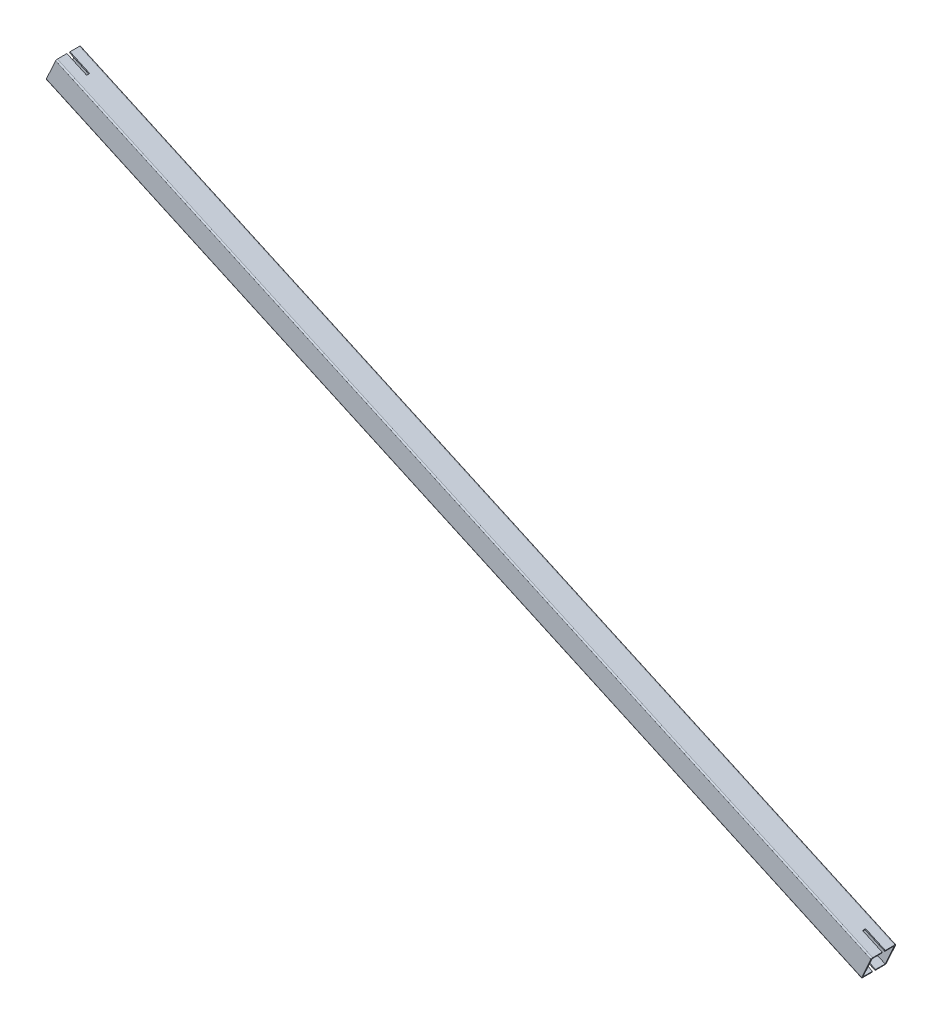
ISO-10303-21;
HEADER;
FILE_DESCRIPTION(('STEP AP214'),'2;1');
FILE_NAME('part.step','',(''),(''),'','','');
FILE_SCHEMA(('AUTOMOTIVE_DESIGN { 1 0 10303 214 1 1 1 1 }'));
ENDSEC;
DATA;
#1=APPLICATION_CONTEXT('core data for automotive mechanical design processes');
#2=APPLICATION_PROTOCOL_DEFINITION('international standard','automotive_design',2000,#1);
#3=PRODUCT_CONTEXT('',#1,'mechanical');
#4=PRODUCT('Part','Part','',(#3));
#5=PRODUCT_RELATED_PRODUCT_CATEGORY('part','',(#4));
#6=PRODUCT_DEFINITION_FORMATION('','',#4);
#7=PRODUCT_DEFINITION_CONTEXT('part definition',#1,'design');
#8=PRODUCT_DEFINITION('design','',#6,#7);
#9=PRODUCT_DEFINITION_SHAPE('','',#8);
#10=(LENGTH_UNIT() NAMED_UNIT(*) SI_UNIT(.MILLI.,.METRE.));
#11=(NAMED_UNIT(*) PLANE_ANGLE_UNIT() SI_UNIT($,.RADIAN.));
#12=(NAMED_UNIT(*) SI_UNIT($,.STERADIAN.) SOLID_ANGLE_UNIT());
#13=UNCERTAINTY_MEASURE_WITH_UNIT(LENGTH_MEASURE(1.E-05),#10,'distance_accuracy_value','');
#14=(GEOMETRIC_REPRESENTATION_CONTEXT(3) GLOBAL_UNCERTAINTY_ASSIGNED_CONTEXT((#13)) GLOBAL_UNIT_ASSIGNED_CONTEXT((#10,
#11,#12)) REPRESENTATION_CONTEXT('',''));
#15=CARTESIAN_POINT('',(0.,0.,0.));
#16=DIRECTION('',(0.,0.,1.));
#17=DIRECTION('',(1.,0.,0.));
#18=AXIS2_PLACEMENT_3D('',#15,#16,#17);
#19=CARTESIAN_POINT('',(2654.95927683345,-1167.25625565126,35.999));
#20=DIRECTION('',(0.910366477462605,-0.413802944301184,0.));
#21=DIRECTION('',(0.413802944301184,0.910366477462605,0.));
#22=AXIS2_PLACEMENT_3D('',#19,#20,#21);
#23=PLANE('',#22);
#24=DIRECTION('',(0.413802944301184,0.910366477462605,0.));
#25=VECTOR('',#24,1.);
#26=CARTESIAN_POINT('',(2654.95927683345,-1167.25625565126,-5.));
#27=LINE('',#26,#25);
#28=CARTESIAN_POINT('',(2623.51066686951,-1236.44319757194,-4.99999999999999));
#29=VERTEX_POINT('',#28);
#30=CARTESIAN_POINT('',(2625.16587864671,-1232.80173166209,-4.99999999999999));
#31=VERTEX_POINT('',#30);
#32=EDGE_CURVE('E369',#29,#31,#27,.T.);
#33=ORIENTED_EDGE('',*,*,#32,.F.);
#34=DIRECTION('',(0.,0.,-1.));
#35=VECTOR('',#34,1.);
#36=CARTESIAN_POINT('',(2623.51066686951,-1236.44319757194,-35.999));
#37=LINE('',#36,#35);
#38=CARTESIAN_POINT('',(2623.51066686951,-1236.44319757194,-35.999));
#39=VERTEX_POINT('',#38);
#40=EDGE_CURVE('E412',#29,#39,#37,.T.);
#41=ORIENTED_EDGE('',*,*,#40,.T.);
#42=CARTESIAN_POINT('',(2625.16629244965,-1232.80082129561,-35.999));
#43=DIRECTION('',(0.910366477462605,-0.413802944301184,0.));
#44=DIRECTION('',(0.413802944301184,0.910366477462605,0.));
#45=AXIS2_PLACEMENT_3D('',#42,#43,#44);
#46=CIRCLE('',#45,4.00099999999998);
#47=CARTESIAN_POINT('',(2625.16629244965,-1232.80082129561,-40.));
#48=VERTEX_POINT('',#47);
#49=EDGE_CURVE('E416',#39,#48,#46,.T.);
#50=ORIENTED_EDGE('',*,*,#49,.T.);
#51=DIRECTION('',(0.413802944301188,0.910366477462603,0.));
#52=VECTOR('',#51,1.);
#53=CARTESIAN_POINT('',(2625.16629244965,-1232.80082129561,-40.));
#54=LINE('',#53,#52);
#55=CARTESIAN_POINT('',(2654.95927683345,-1167.25625565126,-40.));
#56=VERTEX_POINT('',#55);
#57=EDGE_CURVE('E418',#48,#56,#54,.T.);
#58=ORIENTED_EDGE('',*,*,#57,.T.);
#59=CARTESIAN_POINT('',(2654.95927683345,-1167.25625565126,-35.999));
#60=DIRECTION('',(0.910366477462605,-0.413802944301184,0.));
#61=DIRECTION('',(0.413802944301184,0.910366477462605,0.));
#62=AXIS2_PLACEMENT_3D('',#59,#60,#61);
#63=CIRCLE('',#62,4.00099999999998);
#64=CARTESIAN_POINT('',(2656.6149024136,-1163.61387937493,-35.999));
#65=VERTEX_POINT('',#64);
#66=EDGE_CURVE('E420',#56,#65,#63,.T.);
#67=ORIENTED_EDGE('',*,*,#66,.T.);
#68=DIRECTION('',(0.,0.,1.));
#69=VECTOR('',#68,1.);
#70=CARTESIAN_POINT('',(2656.6149024136,-1163.61387937493,35.999));
#71=LINE('',#70,#69);
#72=CARTESIAN_POINT('',(2656.6149024136,-1163.61387937493,-4.99999999999999));
#73=VERTEX_POINT('',#72);
#74=EDGE_CURVE('E346',#65,#73,#71,.T.);
#75=ORIENTED_EDGE('',*,*,#74,.T.);
#76=CARTESIAN_POINT('',(2654.9596906364,-1167.25534528478,-4.99999999999999));
#77=VERTEX_POINT('',#76);
#78=EDGE_CURVE('E368',#77,#73,#27,.T.);
#79=ORIENTED_EDGE('',*,*,#78,.F.);
#80=DIRECTION('',(0.,0.,1.));
#81=VECTOR('',#80,1.);
#82=CARTESIAN_POINT('',(2654.9596906364,-1167.25534528478,35.999));
#83=LINE('',#82,#81);
#84=CARTESIAN_POINT('',(2654.9596906364,-1167.25534528478,-35.999));
#85=VERTEX_POINT('',#84);
#86=EDGE_CURVE('E521',#85,#77,#83,.T.);
#87=ORIENTED_EDGE('',*,*,#86,.F.);
#88=CARTESIAN_POINT('',(2654.95927683345,-1167.25625565126,-35.999));
#89=DIRECTION('',(0.910366477462605,-0.413802944301184,0.));
#90=DIRECTION('',(0.413802944301184,0.910366477462605,0.));
#91=AXIS2_PLACEMENT_3D('',#88,#89,#90);
#92=CIRCLE('',#91,0.00100000000009845);
#93=CARTESIAN_POINT('',(2654.95927683345,-1167.25625565126,-36.0000000000001));
#94=VERTEX_POINT('',#93);
#95=EDGE_CURVE('E524',#94,#85,#92,.T.);
#96=ORIENTED_EDGE('',*,*,#95,.F.);
#97=DIRECTION('',(0.413802944301188,0.910366477462603,0.));
#98=VECTOR('',#97,1.);
#99=CARTESIAN_POINT('',(2625.16629244965,-1232.80082129561,-36.));
#100=LINE('',#99,#98);
#101=CARTESIAN_POINT('',(2625.16629244965,-1232.80082129561,-36.));
#102=VERTEX_POINT('',#101);
#103=EDGE_CURVE('E402',#102,#94,#100,.T.);
#104=ORIENTED_EDGE('',*,*,#103,.F.);
#105=CARTESIAN_POINT('',(2625.16629244965,-1232.80082129561,-35.999));
#106=DIRECTION('',(0.910366477462605,-0.413802944301184,0.));
#107=DIRECTION('',(0.413802944301184,0.910366477462605,0.));
#108=AXIS2_PLACEMENT_3D('',#105,#106,#107);
#109=CIRCLE('',#108,0.00100000000009845);
#110=CARTESIAN_POINT('',(2625.16587864671,-1232.80173166209,-35.999));
#111=VERTEX_POINT('',#110);
#112=EDGE_CURVE('E397',#111,#102,#109,.T.);
#113=ORIENTED_EDGE('',*,*,#112,.F.);
#114=DIRECTION('',(0.,0.,-1.));
#115=VECTOR('',#114,1.);
#116=CARTESIAN_POINT('',(2625.16587864671,-1232.80173166209,-35.999));
#117=LINE('',#116,#115);
#118=EDGE_CURVE('E388',#31,#111,#117,.T.);
#119=ORIENTED_EDGE('',*,*,#118,.F.);
#120=EDGE_LOOP('',(#33,#41,#50,#58,#67,#75,#79,#87,#96,#104,#113,#119));
#121=FACE_BOUND('',#120,.T.);
#122=ADVANCED_FACE('F62',(#121),#23,.T.);
#123=CARTESIAN_POINT('',(14.8964921918981,32.7722828221768,35.999));
#124=DIRECTION('',(0.910366477462605,-0.413802944301184,0.));
#125=DIRECTION('',(0.413802944301184,0.910366477462605,0.));
#126=AXIS2_PLACEMENT_3D('',#123,#124,#125);
#127=PLANE('',#126);
#128=DIRECTION('',(0.,0.,1.));
#129=VECTOR('',#128,1.);
#130=CARTESIAN_POINT('',(16.5521177720471,36.4146590985044,35.999));
#131=LINE('',#130,#129);
#132=CARTESIAN_POINT('',(16.5521177720477,36.4146590985047,5.));
#133=VERTEX_POINT('',#132);
#134=CARTESIAN_POINT('',(16.5521177720471,36.4146590985044,35.999));
#135=VERTEX_POINT('',#134);
#136=EDGE_CURVE('E314',#133,#135,#131,.T.);
#137=ORIENTED_EDGE('',*,*,#136,.F.);
#138=DIRECTION('',(-0.413802944301184,-0.910366477462605,0.));
#139=VECTOR('',#138,1.);
#140=CARTESIAN_POINT('',(14.8964921918981,32.7722828221768,5.));
#141=LINE('',#140,#139);
#142=CARTESIAN_POINT('',(14.8969059948429,32.7731931886541,5.));
#143=VERTEX_POINT('',#142);
#144=EDGE_CURVE('E364',#133,#143,#141,.T.);
#145=ORIENTED_EDGE('',*,*,#144,.T.);
#146=DIRECTION('',(0.,0.,1.));
#147=VECTOR('',#146,1.);
#148=CARTESIAN_POINT('',(14.8969059948421,32.7731931886541,35.999));
#149=LINE('',#148,#147);
#150=CARTESIAN_POINT('',(14.8969059948425,32.7731931886541,35.999));
#151=VERTEX_POINT('',#150);
#152=EDGE_CURVE('E435',#143,#151,#149,.T.);
#153=ORIENTED_EDGE('',*,*,#152,.T.);
#154=CARTESIAN_POINT('',(14.8964921918981,32.7722828221768,35.999));
#155=DIRECTION('',(0.910366477462605,-0.413802944301184,0.));
#156=DIRECTION('',(0.413802944301184,0.910366477462605,0.));
#157=AXIS2_PLACEMENT_3D('',#154,#155,#156);
#158=CIRCLE('',#157,0.00100000000009151);
#159=CARTESIAN_POINT('',(14.8964921918981,32.7722828221768,36.));
#160=VERTEX_POINT('',#159);
#161=EDGE_CURVE('E432',#151,#160,#158,.T.);
#162=ORIENTED_EDGE('',*,*,#161,.T.);
#163=DIRECTION('',(-0.413802944301188,-0.910366477462603,0.));
#164=VECTOR('',#163,1.);
#165=CARTESIAN_POINT('',(14.8964921918981,32.7722828221768,36.));
#166=LINE('',#165,#164);
#167=CARTESIAN_POINT('',(-14.896492191899,-32.7722828221759,36.));
#168=VERTEX_POINT('',#167);
#169=EDGE_CURVE('E428',#160,#168,#166,.T.);
#170=ORIENTED_EDGE('',*,*,#169,.T.);
#171=CARTESIAN_POINT('',(-14.896492191899,-32.7722828221759,35.999));
#172=DIRECTION('',(0.910366477462605,-0.413802944301184,0.));
#173=DIRECTION('',(0.413802944301184,0.910366477462605,0.));
#174=AXIS2_PLACEMENT_3D('',#171,#172,#173);
#175=CIRCLE('',#174,0.00100000000009151);
#176=CARTESIAN_POINT('',(-14.8969059948425,-32.7731931886537,35.999));
#177=VERTEX_POINT('',#176);
#178=EDGE_CURVE('E425',#168,#177,#175,.T.);
#179=ORIENTED_EDGE('',*,*,#178,.T.);
#180=DIRECTION('',(0.,0.,-1.));
#181=VECTOR('',#180,1.);
#182=CARTESIAN_POINT('',(-14.8969059948425,-32.7731931886537,-35.999));
#183=LINE('',#182,#181);
#184=CARTESIAN_POINT('',(-14.8969059948424,-32.7731931886535,5.));
#185=VERTEX_POINT('',#184);
#186=EDGE_CURVE('E449',#177,#185,#183,.T.);
#187=ORIENTED_EDGE('',*,*,#186,.T.);
#188=CARTESIAN_POINT('',(-16.5521177720471,-36.4146590985039,5.));
#189=VERTEX_POINT('',#188);
#190=EDGE_CURVE('E284',#185,#189,#141,.T.);
#191=ORIENTED_EDGE('',*,*,#190,.T.);
#192=DIRECTION('',(0.,0.,-1.));
#193=VECTOR('',#192,1.);
#194=CARTESIAN_POINT('',(-16.552117772048,-36.4146590985035,-35.999));
#195=LINE('',#194,#193);
#196=CARTESIAN_POINT('',(-16.552117772048,-36.4146590985035,35.999));
#197=VERTEX_POINT('',#196);
#198=EDGE_CURVE('E302',#197,#189,#195,.T.);
#199=ORIENTED_EDGE('',*,*,#198,.F.);
#200=CARTESIAN_POINT('',(-14.896492191899,-32.7722828221759,35.999));
#201=DIRECTION('',(0.910366477462605,-0.413802944301184,0.));
#202=DIRECTION('',(0.413802944301184,0.910366477462605,0.));
#203=AXIS2_PLACEMENT_3D('',#200,#201,#202);
#204=CIRCLE('',#203,4.00099999999998);
#205=CARTESIAN_POINT('',(-14.896492191899,-32.7722828221759,40.));
#206=VERTEX_POINT('',#205);
#207=EDGE_CURVE('E303',#206,#197,#204,.T.);
#208=ORIENTED_EDGE('',*,*,#207,.F.);
#209=DIRECTION('',(-0.413802944301188,-0.910366477462603,0.));
#210=VECTOR('',#209,1.);
#211=CARTESIAN_POINT('',(14.8964921918981,32.7722828221768,40.));
#212=LINE('',#211,#210);
#213=CARTESIAN_POINT('',(14.8964921918981,32.7722828221768,40.));
#214=VERTEX_POINT('',#213);
#215=EDGE_CURVE('E305',#214,#206,#212,.T.);
#216=ORIENTED_EDGE('',*,*,#215,.F.);
#217=CARTESIAN_POINT('',(14.8964921918981,32.7722828221768,35.999));
#218=DIRECTION('',(0.910366477462605,-0.413802944301184,0.));
#219=DIRECTION('',(0.413802944301184,0.910366477462605,0.));
#220=AXIS2_PLACEMENT_3D('',#217,#218,#219);
#221=CIRCLE('',#220,4.00099999999998);
#222=EDGE_CURVE('E452',#135,#214,#221,.T.);
#223=ORIENTED_EDGE('',*,*,#222,.F.);
#224=EDGE_LOOP('',(#137,#145,#153,#162,#170,#179,#187,#191,#199,#208,#216,#223));
#225=FACE_BOUND('',#224,.T.);
#226=ADVANCED_FACE('F467',(#225),#127,.F.);
#227=CARTESIAN_POINT('',(2654.95927683345,-1167.25625565126,35.999));
#228=DIRECTION('',(-0.910366477462605,0.413802944301184,0.));
#229=DIRECTION('',(-0.413802944301184,-0.910366477462605,0.));
#230=AXIS2_PLACEMENT_3D('',#227,#228,#229);
#231=CYLINDRICAL_SURFACE('',#230,4.00099999999998);
#232=ORIENTED_EDGE('',*,*,#222,.T.);
#233=DIRECTION('',(-0.910366477462605,0.413802944301184,0.));
#234=VECTOR('',#233,1.);
#235=CARTESIAN_POINT('',(2654.95927683345,-1167.25625565126,40.));
#236=LINE('',#235,#234);
#237=CARTESIAN_POINT('',(2654.95927683345,-1167.25625565126,40.));
#238=VERTEX_POINT('',#237);
#239=EDGE_CURVE('E340',#238,#214,#236,.T.);
#240=ORIENTED_EDGE('',*,*,#239,.F.);
#241=CARTESIAN_POINT('',(2654.95927683345,-1167.25625565126,35.999));
#242=DIRECTION('',(0.910366477462605,-0.413802944301184,0.));
#243=DIRECTION('',(0.413802944301184,0.910366477462605,0.));
#244=AXIS2_PLACEMENT_3D('',#241,#242,#243);
#245=CIRCLE('',#244,4.00099999999998);
#246=CARTESIAN_POINT('',(2656.6149024136,-1163.61387937493,35.999));
#247=VERTEX_POINT('',#246);
#248=EDGE_CURVE('E401',#247,#238,#245,.T.);
#249=ORIENTED_EDGE('',*,*,#248,.F.);
#250=DIRECTION('',(-0.910366477462605,0.413802944301184,0.));
#251=VECTOR('',#250,1.);
#252=CARTESIAN_POINT('',(2656.6149024136,-1163.61387937493,35.999));
#253=LINE('',#252,#251);
#254=EDGE_CURVE('E319',#247,#135,#253,.T.);
#255=ORIENTED_EDGE('',*,*,#254,.T.);
#256=EDGE_LOOP('',(#232,#240,#249,#255));
#257=FACE_BOUND('',#256,.T.);
#258=ADVANCED_FACE('F481',(#257),#231,.T.);
#259=CARTESIAN_POINT('',(2654.95927683345,-1167.25625565126,40.));
#260=DIRECTION('',(0.,0.,-1.));
#261=DIRECTION('',(-1.,0.,0.));
#262=AXIS2_PLACEMENT_3D('',#259,#260,#261);
#263=PLANE('',#262);
#264=ORIENTED_EDGE('',*,*,#215,.T.);
#265=DIRECTION('',(-0.910366477462605,0.413802944301184,0.));
#266=VECTOR('',#265,1.);
#267=CARTESIAN_POINT('',(2625.16629244965,-1232.80082129561,40.));
#268=LINE('',#267,#266);
#269=CARTESIAN_POINT('',(2625.16629244965,-1232.80082129561,40.));
#270=VERTEX_POINT('',#269);
#271=EDGE_CURVE('E337',#270,#206,#268,.T.);
#272=ORIENTED_EDGE('',*,*,#271,.F.);
#273=DIRECTION('',(-0.413802944301188,-0.910366477462603,0.));
#274=VECTOR('',#273,1.);
#275=CARTESIAN_POINT('',(2654.95927683345,-1167.25625565126,40.));
#276=LINE('',#275,#274);
#277=EDGE_CURVE('E408',#238,#270,#276,.T.);
#278=ORIENTED_EDGE('',*,*,#277,.F.);
#279=ORIENTED_EDGE('',*,*,#239,.T.);
#280=EDGE_LOOP('',(#264,#272,#278,#279));
#281=FACE_BOUND('',#280,.T.);
#282=ADVANCED_FACE('F456',(#281),#263,.F.);
#283=CARTESIAN_POINT('',(2625.16629244965,-1232.80082129561,35.999));
#284=DIRECTION('',(-0.910366477462605,0.413802944301184,0.));
#285=DIRECTION('',(-0.413802944301184,-0.910366477462605,0.));
#286=AXIS2_PLACEMENT_3D('',#283,#284,#285);
#287=CYLINDRICAL_SURFACE('',#286,4.00099999999998);
#288=ORIENTED_EDGE('',*,*,#207,.T.);
#289=DIRECTION('',(-0.910366477462605,0.413802944301184,0.));
#290=VECTOR('',#289,1.);
#291=CARTESIAN_POINT('',(2623.51066686951,-1236.44319757194,35.999));
#292=LINE('',#291,#290);
#293=CARTESIAN_POINT('',(2623.51066686951,-1236.44319757194,35.999));
#294=VERTEX_POINT('',#293);
#295=EDGE_CURVE('E334',#294,#197,#292,.T.);
#296=ORIENTED_EDGE('',*,*,#295,.F.);
#297=CARTESIAN_POINT('',(2625.16629244965,-1232.80082129561,35.999));
#298=DIRECTION('',(0.910366477462605,-0.413802944301184,0.));
#299=DIRECTION('',(0.413802944301184,0.910366477462605,0.));
#300=AXIS2_PLACEMENT_3D('',#297,#298,#299);
#301=CIRCLE('',#300,4.00099999999998);
#302=EDGE_CURVE('E410',#270,#294,#301,.T.);
#303=ORIENTED_EDGE('',*,*,#302,.F.);
#304=ORIENTED_EDGE('',*,*,#271,.T.);
#305=EDGE_LOOP('',(#288,#296,#303,#304));
#306=FACE_BOUND('',#305,.T.);
#307=ADVANCED_FACE('F463',(#306),#287,.T.);
#308=CARTESIAN_POINT('',(2623.51066686951,-1236.44319757194,-35.999));
#309=DIRECTION('',(0.413802944301184,0.910366477462605,0.));
#310=DIRECTION('',(-0.910366477462605,0.413802944301184,0.));
#311=AXIS2_PLACEMENT_3D('',#308,#309,#310);
#312=PLANE('',#311);
#313=ORIENTED_EDGE('',*,*,#198,.T.);
#314=DIRECTION('',(-0.910366477462605,0.413802944301184,0.));
#315=VECTOR('',#314,1.);
#316=CARTESIAN_POINT('',(-16.5521177720471,-36.4146590985039,5.));
#317=LINE('',#316,#315);
#318=CARTESIAN_POINT('',(47.1735356503352,-65.3808651995868,5.));
#319=VERTEX_POINT('',#318);
#320=EDGE_CURVE('E468',#319,#189,#317,.T.);
#321=ORIENTED_EDGE('',*,*,#320,.F.);
#322=DIRECTION('',(0.,0.,1.));
#323=VECTOR('',#322,1.);
#324=CARTESIAN_POINT('',(47.1735356503352,-65.3808651995868,5.));
#325=LINE('',#324,#323);
#326=CARTESIAN_POINT('',(47.1735356503352,-65.3808651995868,-5.));
#327=VERTEX_POINT('',#326);
#328=EDGE_CURVE('E295',#327,#319,#325,.T.);
#329=ORIENTED_EDGE('',*,*,#328,.F.);
#330=DIRECTION('',(0.910366477462605,-0.413802944301184,0.));
#331=VECTOR('',#330,1.);
#332=CARTESIAN_POINT('',(-16.5521177720471,-36.4146590985039,-5.));
#333=LINE('',#332,#331);
#334=CARTESIAN_POINT('',(-16.5521177720471,-36.4146590985039,-5.));
#335=VERTEX_POINT('',#334);
#336=EDGE_CURVE('E277',#335,#327,#333,.T.);
#337=ORIENTED_EDGE('',*,*,#336,.F.);
#338=CARTESIAN_POINT('',(-16.552117772048,-36.4146590985035,-35.999));
#339=VERTEX_POINT('',#338);
#340=EDGE_CURVE('E291',#335,#339,#195,.T.);
#341=ORIENTED_EDGE('',*,*,#340,.T.);
#342=DIRECTION('',(-0.910366477462605,0.413802944301184,0.));
#343=VECTOR('',#342,1.);
#344=CARTESIAN_POINT('',(2623.51066686951,-1236.44319757194,-35.999));
#345=LINE('',#344,#343);
#346=EDGE_CURVE('E332',#39,#339,#345,.T.);
#347=ORIENTED_EDGE('',*,*,#346,.F.);
#348=ORIENTED_EDGE('',*,*,#40,.F.);
#349=DIRECTION('',(0.910366477462604,-0.413802944301185,0.));
#350=VECTOR('',#349,1.);
#351=CARTESIAN_POINT('',(2623.51066686951,-1236.44319757194,-4.99999999999999));
#352=LINE('',#351,#350);
#353=CARTESIAN_POINT('',(2559.78501344712,-1207.47699147085,-5.));
#354=VERTEX_POINT('',#353);
#355=EDGE_CURVE('E380',#354,#29,#352,.T.);
#356=ORIENTED_EDGE('',*,*,#355,.F.);
#357=DIRECTION('',(0.,0.,-1.));
#358=VECTOR('',#357,1.);
#359=CARTESIAN_POINT('',(2559.78501344712,-1207.47699147085,5.));
#360=LINE('',#359,#358);
#361=CARTESIAN_POINT('',(2559.78501344712,-1207.47699147085,5.));
#362=VERTEX_POINT('',#361);
#363=EDGE_CURVE('E560',#362,#354,#360,.T.);
#364=ORIENTED_EDGE('',*,*,#363,.F.);
#365=DIRECTION('',(-0.910366477462604,0.413802944301185,0.));
#366=VECTOR('',#365,1.);
#367=CARTESIAN_POINT('',(2623.51066686951,-1236.44319757194,4.99999999999999));
#368=LINE('',#367,#366);
#369=CARTESIAN_POINT('',(2623.51066686951,-1236.44319757194,4.99999999999999));
#370=VERTEX_POINT('',#369);
#371=EDGE_CURVE('E473',#370,#362,#368,.T.);
#372=ORIENTED_EDGE('',*,*,#371,.F.);
#373=EDGE_CURVE('E413',#294,#370,#37,.T.);
#374=ORIENTED_EDGE('',*,*,#373,.F.);
#375=ORIENTED_EDGE('',*,*,#295,.T.);
#376=EDGE_LOOP('',(#313,#321,#329,#337,#341,#347,#348,#356,#364,#372,#374,#375));
#377=FACE_BOUND('',#376,.T.);
#378=ADVANCED_FACE('F289',(#377),#312,.F.);
#379=CARTESIAN_POINT('',(2625.16629244965,-1232.80082129561,-35.999));
#380=DIRECTION('',(-0.910366477462605,0.413802944301184,0.));
#381=DIRECTION('',(-0.413802944301184,-0.910366477462605,0.));
#382=AXIS2_PLACEMENT_3D('',#379,#380,#381);
#383=CYLINDRICAL_SURFACE('',#382,4.00099999999998);
#384=CARTESIAN_POINT('',(-14.896492191899,-32.7722828221759,-35.999));
#385=DIRECTION('',(0.910366477462605,-0.413802944301184,0.));
#386=DIRECTION('',(0.413802944301184,0.910366477462605,0.));
#387=AXIS2_PLACEMENT_3D('',#384,#385,#386);
#388=CIRCLE('',#387,4.00099999999998);
#389=CARTESIAN_POINT('',(-14.896492191899,-32.7722828221759,-40.));
#390=VERTEX_POINT('',#389);
#391=EDGE_CURVE('E301',#339,#390,#388,.T.);
#392=ORIENTED_EDGE('',*,*,#391,.T.);
#393=DIRECTION('',(-0.910366477462605,0.413802944301184,0.));
#394=VECTOR('',#393,1.);
#395=CARTESIAN_POINT('',(2625.16629244965,-1232.80082129561,-40.));
#396=LINE('',#395,#394);
#397=EDGE_CURVE('E329',#48,#390,#396,.T.);
#398=ORIENTED_EDGE('',*,*,#397,.F.);
#399=ORIENTED_EDGE('',*,*,#49,.F.);
#400=ORIENTED_EDGE('',*,*,#346,.T.);
#401=EDGE_LOOP('',(#392,#398,#399,#400));
#402=FACE_BOUND('',#401,.T.);
#403=ADVANCED_FACE('F623',(#402),#383,.T.);
#404=CARTESIAN_POINT('',(2625.16629244965,-1232.80082129561,-40.));
#405=DIRECTION('',(0.,0.,1.));
#406=DIRECTION('',(1.,0.,0.));
#407=AXIS2_PLACEMENT_3D('',#404,#405,#406);
#408=PLANE('',#407);
#409=DIRECTION('',(0.413802944301188,0.910366477462603,0.));
#410=VECTOR('',#409,1.);
#411=CARTESIAN_POINT('',(-14.896492191899,-32.7722828221759,-40.));
#412=LINE('',#411,#410);
#413=CARTESIAN_POINT('',(14.8964921918981,32.7722828221768,-40.));
#414=VERTEX_POINT('',#413);
#415=EDGE_CURVE('E310',#390,#414,#412,.T.);
#416=ORIENTED_EDGE('',*,*,#415,.T.);
#417=DIRECTION('',(-0.910366477462605,0.413802944301184,0.));
#418=VECTOR('',#417,1.);
#419=CARTESIAN_POINT('',(2654.95927683345,-1167.25625565126,-40.));
#420=LINE('',#419,#418);
#421=EDGE_CURVE('E326',#56,#414,#420,.T.);
#422=ORIENTED_EDGE('',*,*,#421,.F.);
#423=ORIENTED_EDGE('',*,*,#57,.F.);
#424=ORIENTED_EDGE('',*,*,#397,.T.);
#425=EDGE_LOOP('',(#416,#422,#423,#424));
#426=FACE_BOUND('',#425,.T.);
#427=ADVANCED_FACE('F619',(#426),#408,.F.);
#428=CARTESIAN_POINT('',(2654.95927683345,-1167.25625565126,-35.999));
#429=DIRECTION('',(-0.910366477462605,0.413802944301184,0.));
#430=DIRECTION('',(-0.413802944301184,-0.910366477462605,0.));
#431=AXIS2_PLACEMENT_3D('',#428,#429,#430);
#432=CYLINDRICAL_SURFACE('',#431,4.00099999999998);
#433=CARTESIAN_POINT('',(14.8964921918981,32.7722828221768,-35.999));
#434=DIRECTION('',(0.910366477462605,-0.413802944301184,0.));
#435=DIRECTION('',(0.413802944301184,0.910366477462605,0.));
#436=AXIS2_PLACEMENT_3D('',#433,#434,#435);
#437=CIRCLE('',#436,4.00099999999998);
#438=CARTESIAN_POINT('',(16.5521177720471,36.4146590985044,-35.999));
#439=VERTEX_POINT('',#438);
#440=EDGE_CURVE('E312',#414,#439,#437,.T.);
#441=ORIENTED_EDGE('',*,*,#440,.T.);
#442=DIRECTION('',(-0.910366477462605,0.413802944301184,0.));
#443=VECTOR('',#442,1.);
#444=CARTESIAN_POINT('',(2656.6149024136,-1163.61387937493,-35.999));
#445=LINE('',#444,#443);
#446=EDGE_CURVE('E322',#65,#439,#445,.T.);
#447=ORIENTED_EDGE('',*,*,#446,.F.);
#448=ORIENTED_EDGE('',*,*,#66,.F.);
#449=ORIENTED_EDGE('',*,*,#421,.T.);
#450=EDGE_LOOP('',(#441,#447,#448,#449));
#451=FACE_BOUND('',#450,.T.);
#452=ADVANCED_FACE('F616',(#451),#432,.T.);
#453=CARTESIAN_POINT('',(2625.16629244965,-1232.80082129561,35.999));
#454=DIRECTION('',(-0.910366477462605,0.413802944301184,0.));
#455=DIRECTION('',(-0.413802944301184,-0.910366477462605,0.));
#456=AXIS2_PLACEMENT_3D('',#453,#454,#455);
#457=CYLINDRICAL_SURFACE('',#456,0.00100000000009151);
#458=ORIENTED_EDGE('',*,*,#178,.F.);
#459=DIRECTION('',(-0.910366477462605,0.413802944301184,0.));
#460=VECTOR('',#459,1.);
#461=CARTESIAN_POINT('',(2625.16629244965,-1232.80082129561,36.));
#462=LINE('',#461,#460);
#463=CARTESIAN_POINT('',(2625.16629244965,-1232.80082129561,36.));
#464=VERTEX_POINT('',#463);
#465=EDGE_CURVE('E323',#464,#168,#462,.T.);
#466=ORIENTED_EDGE('',*,*,#465,.F.);
#467=CARTESIAN_POINT('',(2625.16629244965,-1232.80082129561,35.999));
#468=DIRECTION('',(0.910366477462605,-0.413802944301184,0.));
#469=DIRECTION('',(0.413802944301184,0.910366477462605,0.));
#470=AXIS2_PLACEMENT_3D('',#467,#468,#469);
#471=CIRCLE('',#470,0.00100000000009151);
#472=CARTESIAN_POINT('',(2625.16587864671,-1232.80173166209,35.999));
#473=VERTEX_POINT('',#472);
#474=EDGE_CURVE('E318',#464,#473,#471,.T.);
#475=ORIENTED_EDGE('',*,*,#474,.T.);
#476=DIRECTION('',(-0.910366477462605,0.413802944301184,0.));
#477=VECTOR('',#476,1.);
#478=CARTESIAN_POINT('',(2625.16587864671,-1232.80173166209,35.999));
#479=LINE('',#478,#477);
#480=EDGE_CURVE('E343',#473,#177,#479,.T.);
#481=ORIENTED_EDGE('',*,*,#480,.T.);
#482=EDGE_LOOP('',(#458,#466,#475,#481));
#483=FACE_BOUND('',#482,.T.);
#484=ADVANCED_FACE('F64',(#483),#457,.F.);
#485=CARTESIAN_POINT('',(2654.95927683345,-1167.25625565126,36.));
#486=DIRECTION('',(0.,0.,-1.));
#487=DIRECTION('',(-1.,0.,0.));
#488=AXIS2_PLACEMENT_3D('',#485,#486,#487);
#489=PLANE('',#488);
#490=ORIENTED_EDGE('',*,*,#169,.F.);
#491=DIRECTION('',(-0.910366477462605,0.413802944301184,0.));
#492=VECTOR('',#491,1.);
#493=CARTESIAN_POINT('',(2654.95927683345,-1167.25625565126,36.));
#494=LINE('',#493,#492);
#495=CARTESIAN_POINT('',(2654.95927683345,-1167.25625565126,36.));
#496=VERTEX_POINT('',#495);
#497=EDGE_CURVE('E358',#496,#160,#494,.T.);
#498=ORIENTED_EDGE('',*,*,#497,.F.);
#499=DIRECTION('',(-0.413802944301188,-0.910366477462603,0.));
#500=VECTOR('',#499,1.);
#501=CARTESIAN_POINT('',(2654.95927683345,-1167.25625565126,36.));
#502=LINE('',#501,#500);
#503=EDGE_CURVE('E514',#496,#464,#502,.T.);
#504=ORIENTED_EDGE('',*,*,#503,.T.);
#505=ORIENTED_EDGE('',*,*,#465,.T.);
#506=EDGE_LOOP('',(#490,#498,#504,#505));
#507=FACE_BOUND('',#506,.T.);
#508=ADVANCED_FACE('F579',(#507),#489,.T.);
#509=CARTESIAN_POINT('',(2654.95927683345,-1167.25625565126,35.999));
#510=DIRECTION('',(-0.910366477462605,0.413802944301184,0.));
#511=DIRECTION('',(-0.413802944301184,-0.910366477462605,0.));
#512=AXIS2_PLACEMENT_3D('',#509,#510,#511);
#513=CYLINDRICAL_SURFACE('',#512,0.00100000000009151);
#514=ORIENTED_EDGE('',*,*,#161,.F.);
#515=DIRECTION('',(-0.910366477462605,0.413802944301184,0.));
#516=VECTOR('',#515,1.);
#517=CARTESIAN_POINT('',(2654.9596906364,-1167.25534528478,35.999));
#518=LINE('',#517,#516);
#519=CARTESIAN_POINT('',(2654.9596906364,-1167.25534528478,35.999));
#520=VERTEX_POINT('',#519);
#521=EDGE_CURVE('E355',#520,#151,#518,.T.);
#522=ORIENTED_EDGE('',*,*,#521,.F.);
#523=CARTESIAN_POINT('',(2654.95927683345,-1167.25625565126,35.999));
#524=DIRECTION('',(0.910366477462605,-0.413802944301184,0.));
#525=DIRECTION('',(0.413802944301184,0.910366477462605,0.));
#526=AXIS2_PLACEMENT_3D('',#523,#524,#525);
#527=CIRCLE('',#526,0.00100000000009151);
#528=EDGE_CURVE('E517',#520,#496,#527,.T.);
#529=ORIENTED_EDGE('',*,*,#528,.T.);
#530=ORIENTED_EDGE('',*,*,#497,.T.);
#531=EDGE_LOOP('',(#514,#522,#529,#530));
#532=FACE_BOUND('',#531,.T.);
#533=ADVANCED_FACE('F575',(#532),#513,.F.);
#534=CARTESIAN_POINT('',(2654.9596906364,-1167.25534528478,35.999));
#535=DIRECTION('',(-0.413802944301184,-0.910366477462605,0.));
#536=DIRECTION('',(0.910366477462605,-0.413802944301184,0.));
#537=AXIS2_PLACEMENT_3D('',#534,#535,#536);
#538=PLANE('',#537);
#539=DIRECTION('',(-0.910366477462605,0.413802944301184,0.));
#540=VECTOR('',#539,1.);
#541=CARTESIAN_POINT('',(2654.9596906364,-1167.25534528478,5.));
#542=LINE('',#541,#540);
#543=CARTESIAN_POINT('',(78.6225594172251,3.80698708757121,5.));
#544=VERTEX_POINT('',#543);
#545=EDGE_CURVE('E494',#544,#143,#542,.T.);
#546=ORIENTED_EDGE('',*,*,#545,.F.);
#547=DIRECTION('',(0.,0.,1.));
#548=VECTOR('',#547,1.);
#549=CARTESIAN_POINT('',(78.6225594172247,3.80698708757121,35.999));
#550=LINE('',#549,#548);
#551=CARTESIAN_POINT('',(78.6225594172251,3.80698708757077,-5.));
#552=VERTEX_POINT('',#551);
#553=EDGE_CURVE('E429',#552,#544,#550,.T.);
#554=ORIENTED_EDGE('',*,*,#553,.F.);
#555=DIRECTION('',(0.910366477462605,-0.413802944301184,0.));
#556=VECTOR('',#555,1.);
#557=CARTESIAN_POINT('',(2654.9596906364,-1167.25534528478,-5.));
#558=LINE('',#557,#556);
#559=CARTESIAN_POINT('',(14.8969059948429,32.7731931886541,-5.));
#560=VERTEX_POINT('',#559);
#561=EDGE_CURVE('E492',#560,#552,#558,.T.);
#562=ORIENTED_EDGE('',*,*,#561,.F.);
#563=CARTESIAN_POINT('',(14.8969059948421,32.7731931886541,-35.999));
#564=VERTEX_POINT('',#563);
#565=EDGE_CURVE('E436',#564,#560,#149,.T.);
#566=ORIENTED_EDGE('',*,*,#565,.F.);
#567=DIRECTION('',(-0.910366477462605,0.413802944301184,0.));
#568=VECTOR('',#567,1.);
#569=CARTESIAN_POINT('',(2654.9596906364,-1167.25534528478,-35.999));
#570=LINE('',#569,#568);
#571=EDGE_CURVE('E353',#85,#564,#570,.T.);
#572=ORIENTED_EDGE('',*,*,#571,.F.);
#573=ORIENTED_EDGE('',*,*,#86,.T.);
#574=DIRECTION('',(0.910366477462605,-0.413802944301184,0.));
#575=VECTOR('',#574,1.);
#576=CARTESIAN_POINT('',(2654.9596906364,-1167.25534528478,-5.));
#577=LINE('',#576,#575);
#578=CARTESIAN_POINT('',(2591.23403721401,-1138.2891391837,-5.));
#579=VERTEX_POINT('',#578);
#580=EDGE_CURVE('E391',#579,#77,#577,.T.);
#581=ORIENTED_EDGE('',*,*,#580,.F.);
#582=DIRECTION('',(0.,0.,-1.));
#583=VECTOR('',#582,1.);
#584=CARTESIAN_POINT('',(2591.23403721401,-1138.2891391837,35.999));
#585=LINE('',#584,#583);
#586=CARTESIAN_POINT('',(2591.23403721401,-1138.2891391837,5.));
#587=VERTEX_POINT('',#586);
#588=EDGE_CURVE('E507',#587,#579,#585,.T.);
#589=ORIENTED_EDGE('',*,*,#588,.F.);
#590=DIRECTION('',(-0.910366477462605,0.413802944301184,0.));
#591=VECTOR('',#590,1.);
#592=CARTESIAN_POINT('',(2654.9596906364,-1167.25534528478,4.99999999999999));
#593=LINE('',#592,#591);
#594=CARTESIAN_POINT('',(2654.9596906364,-1167.25534528478,4.99999999999999));
#595=VERTEX_POINT('',#594);
#596=EDGE_CURVE('E502',#595,#587,#593,.T.);
#597=ORIENTED_EDGE('',*,*,#596,.F.);
#598=EDGE_CURVE('E520',#595,#520,#83,.T.);
#599=ORIENTED_EDGE('',*,*,#598,.T.);
#600=ORIENTED_EDGE('',*,*,#521,.T.);
#601=ORIENTED_EDGE('',*,*,#152,.F.);
#602=EDGE_LOOP('',(#546,#554,#562,#566,#572,#573,#581,#589,#597,#599,#600,#601));
#603=FACE_BOUND('',#602,.T.);
#604=ADVANCED_FACE('F543',(#603),#538,.T.);
#605=CARTESIAN_POINT('',(2654.95927683345,-1167.25625565126,-35.999));
#606=DIRECTION('',(-0.910366477462605,0.413802944301184,0.));
#607=DIRECTION('',(-0.413802944301184,-0.910366477462605,0.));
#608=AXIS2_PLACEMENT_3D('',#605,#606,#607);
#609=CYLINDRICAL_SURFACE('',#608,0.00100000000009845);
#610=CARTESIAN_POINT('',(14.8964921918981,32.7722828221768,-35.999));
#611=DIRECTION('',(0.910366477462605,-0.413802944301184,0.));
#612=DIRECTION('',(0.413802944301184,0.910366477462605,0.));
#613=AXIS2_PLACEMENT_3D('',#610,#611,#612);
#614=CIRCLE('',#613,0.00100000000009845);
#615=CARTESIAN_POINT('',(14.8964921918981,32.7722828221768,-36.0000000000001));
#616=VERTEX_POINT('',#615);
#617=EDGE_CURVE('E439',#616,#564,#614,.T.);
#618=ORIENTED_EDGE('',*,*,#617,.F.);
#619=DIRECTION('',(-0.910366477462605,0.413802944301184,0.));
#620=VECTOR('',#619,1.);
#621=CARTESIAN_POINT('',(2654.95927683345,-1167.25625565126,-36.0000000000001));
#622=LINE('',#621,#620);
#623=EDGE_CURVE('E351',#94,#616,#622,.T.);
#624=ORIENTED_EDGE('',*,*,#623,.F.);
#625=ORIENTED_EDGE('',*,*,#95,.T.);
#626=ORIENTED_EDGE('',*,*,#571,.T.);
#627=EDGE_LOOP('',(#618,#624,#625,#626));
#628=FACE_BOUND('',#627,.T.);
#629=ADVANCED_FACE('F539',(#628),#609,.F.);
#630=CARTESIAN_POINT('',(2625.16629244965,-1232.80082129561,-36.));
#631=DIRECTION('',(0.,0.,1.));
#632=DIRECTION('',(1.,0.,0.));
#633=AXIS2_PLACEMENT_3D('',#630,#631,#632);
#634=PLANE('',#633);
#635=DIRECTION('',(0.413802944301188,0.910366477462603,0.));
#636=VECTOR('',#635,1.);
#637=CARTESIAN_POINT('',(-14.896492191899,-32.7722828221759,-36.));
#638=LINE('',#637,#636);
#639=CARTESIAN_POINT('',(-14.896492191899,-32.7722828221759,-36.));
#640=VERTEX_POINT('',#639);
#641=EDGE_CURVE('E442',#640,#616,#638,.T.);
#642=ORIENTED_EDGE('',*,*,#641,.F.);
#643=DIRECTION('',(-0.910366477462605,0.413802944301184,0.));
#644=VECTOR('',#643,1.);
#645=CARTESIAN_POINT('',(2625.16629244965,-1232.80082129561,-36.));
#646=LINE('',#645,#644);
#647=EDGE_CURVE('E349',#102,#640,#646,.T.);
#648=ORIENTED_EDGE('',*,*,#647,.F.);
#649=ORIENTED_EDGE('',*,*,#103,.T.);
#650=ORIENTED_EDGE('',*,*,#623,.T.);
#651=EDGE_LOOP('',(#642,#648,#649,#650));
#652=FACE_BOUND('',#651,.T.);
#653=ADVANCED_FACE('F529',(#652),#634,.T.);
#654=CARTESIAN_POINT('',(2625.16629244965,-1232.80082129561,-35.999));
#655=DIRECTION('',(-0.910366477462605,0.413802944301184,0.));
#656=DIRECTION('',(-0.413802944301184,-0.910366477462605,0.));
#657=AXIS2_PLACEMENT_3D('',#654,#655,#656);
#658=CYLINDRICAL_SURFACE('',#657,0.00100000000009845);
#659=CARTESIAN_POINT('',(-14.896492191899,-32.7722828221759,-35.999));
#660=DIRECTION('',(0.910366477462605,-0.413802944301184,0.));
#661=DIRECTION('',(0.413802944301184,0.910366477462605,0.));
#662=AXIS2_PLACEMENT_3D('',#659,#660,#661);
#663=CIRCLE('',#662,0.00100000000009845);
#664=CARTESIAN_POINT('',(-14.8969059948434,-32.7731931886532,-35.999));
#665=VERTEX_POINT('',#664);
#666=EDGE_CURVE('E445',#665,#640,#663,.T.);
#667=ORIENTED_EDGE('',*,*,#666,.F.);
#668=DIRECTION('',(-0.910366477462605,0.413802944301184,0.));
#669=VECTOR('',#668,1.);
#670=CARTESIAN_POINT('',(2625.16587864671,-1232.80173166209,-35.999));
#671=LINE('',#670,#669);
#672=EDGE_CURVE('E345',#111,#665,#671,.T.);
#673=ORIENTED_EDGE('',*,*,#672,.F.);
#674=ORIENTED_EDGE('',*,*,#112,.T.);
#675=ORIENTED_EDGE('',*,*,#647,.T.);
#676=EDGE_LOOP('',(#667,#673,#674,#675));
#677=FACE_BOUND('',#676,.T.);
#678=ADVANCED_FACE('F535',(#677),#658,.F.);
#679=CARTESIAN_POINT('',(2625.16587864671,-1232.80173166209,-35.999));
#680=DIRECTION('',(0.413802944301184,0.910366477462605,0.));
#681=DIRECTION('',(-0.910366477462605,0.413802944301184,0.));
#682=AXIS2_PLACEMENT_3D('',#679,#680,#681);
#683=PLANE('',#682);
#684=DIRECTION('',(0.910366477462605,-0.413802944301184,0.));
#685=VECTOR('',#684,1.);
#686=CARTESIAN_POINT('',(2625.16587864671,-1232.80173166209,5.));
#687=LINE('',#686,#685);
#688=CARTESIAN_POINT('',(48.8287474275399,-61.7393992897364,5.));
#689=VERTEX_POINT('',#688);
#690=EDGE_CURVE('E491',#185,#689,#687,.T.);
#691=ORIENTED_EDGE('',*,*,#690,.F.);
#692=ORIENTED_EDGE('',*,*,#186,.F.);
#693=ORIENTED_EDGE('',*,*,#480,.F.);
#694=CARTESIAN_POINT('',(2625.16587864671,-1232.80173166209,5.));
#695=VERTEX_POINT('',#694);
#696=EDGE_CURVE('E398',#473,#695,#117,.T.);
#697=ORIENTED_EDGE('',*,*,#696,.T.);
#698=DIRECTION('',(0.910366477462605,-0.413802944301184,0.));
#699=VECTOR('',#698,1.);
#700=CARTESIAN_POINT('',(2625.16587864671,-1232.80173166209,5.));
#701=LINE('',#700,#699);
#702=CARTESIAN_POINT('',(2561.44022522433,-1203.835525561,5.));
#703=VERTEX_POINT('',#702);
#704=EDGE_CURVE('E85',#703,#695,#701,.T.);
#705=ORIENTED_EDGE('',*,*,#704,.F.);
#706=DIRECTION('',(0.,0.,1.));
#707=VECTOR('',#706,1.);
#708=CARTESIAN_POINT('',(2561.44022522433,-1203.835525561,-35.999));
#709=LINE('',#708,#707);
#710=CARTESIAN_POINT('',(2561.44022522433,-1203.835525561,-5.));
#711=VERTEX_POINT('',#710);
#712=EDGE_CURVE('E390',#711,#703,#709,.T.);
#713=ORIENTED_EDGE('',*,*,#712,.F.);
#714=DIRECTION('',(-0.910366477462605,0.413802944301184,0.));
#715=VECTOR('',#714,1.);
#716=CARTESIAN_POINT('',(2625.16587864671,-1232.80173166209,-4.99999999999999));
#717=LINE('',#716,#715);
#718=EDGE_CURVE('E377',#31,#711,#717,.T.);
#719=ORIENTED_EDGE('',*,*,#718,.F.);
#720=ORIENTED_EDGE('',*,*,#118,.T.);
#721=ORIENTED_EDGE('',*,*,#672,.T.);
#722=CARTESIAN_POINT('',(-14.8969059948425,-32.7731931886537,-5.));
#723=VERTEX_POINT('',#722);
#724=EDGE_CURVE('E448',#723,#665,#183,.T.);
#725=ORIENTED_EDGE('',*,*,#724,.F.);
#726=DIRECTION('',(-0.910366477462605,0.413802944301184,0.));
#727=VECTOR('',#726,1.);
#728=CARTESIAN_POINT('',(2625.16587864671,-1232.80173166209,-5.));
#729=LINE('',#728,#727);
#730=CARTESIAN_POINT('',(48.8287474275398,-61.7393992897364,-5.));
#731=VERTEX_POINT('',#730);
#732=EDGE_CURVE('E280',#731,#723,#729,.T.);
#733=ORIENTED_EDGE('',*,*,#732,.F.);
#734=DIRECTION('',(0.,0.,-1.));
#735=VECTOR('',#734,1.);
#736=CARTESIAN_POINT('',(48.8287474275397,-61.7393992897364,-35.999));
#737=LINE('',#736,#735);
#738=EDGE_CURVE('E509',#689,#731,#737,.T.);
#739=ORIENTED_EDGE('',*,*,#738,.F.);
#740=EDGE_LOOP('',(#691,#692,#693,#697,#705,#713,#719,#720,#721,#725,#733,#739));
#741=FACE_BOUND('',#740,.T.);
#742=ADVANCED_FACE('F387',(#741),#683,.T.);
#743=CARTESIAN_POINT('',(2656.6149024136,-1163.61387937493,35.999));
#744=DIRECTION('',(-0.413802944301184,-0.910366477462605,0.));
#745=DIRECTION('',(0.910366477462605,-0.413802944301184,0.));
#746=AXIS2_PLACEMENT_3D('',#743,#744,#745);
#747=PLANE('',#746);
#748=DIRECTION('',(0.,0.,1.));
#749=VECTOR('',#748,1.);
#750=CARTESIAN_POINT('',(80.2777711944298,7.44845299742147,35.999));
#751=LINE('',#750,#749);
#752=CARTESIAN_POINT('',(80.2777711944299,7.44845299742114,-5.));
#753=VERTEX_POINT('',#752);
#754=CARTESIAN_POINT('',(80.2777711944299,7.44845299742158,5.));
#755=VERTEX_POINT('',#754);
#756=EDGE_CURVE('E12',#753,#755,#751,.T.);
#757=ORIENTED_EDGE('',*,*,#756,.T.);
#758=DIRECTION('',(-0.910366477462605,0.413802944301184,0.));
#759=VECTOR('',#758,1.);
#760=CARTESIAN_POINT('',(2656.6149024136,-1163.61387937493,5.));
#761=LINE('',#760,#759);
#762=EDGE_CURVE('E486',#755,#133,#761,.T.);
#763=ORIENTED_EDGE('',*,*,#762,.T.);
#764=ORIENTED_EDGE('',*,*,#136,.T.);
#765=ORIENTED_EDGE('',*,*,#254,.F.);
#766=CARTESIAN_POINT('',(2656.6149024136,-1163.61387937493,4.99999999999999));
#767=VERTEX_POINT('',#766);
#768=EDGE_CURVE('E422',#767,#247,#71,.T.);
#769=ORIENTED_EDGE('',*,*,#768,.F.);
#770=DIRECTION('',(-0.910366477462605,0.413802944301184,0.));
#771=VECTOR('',#770,1.);
#772=CARTESIAN_POINT('',(2656.6149024136,-1163.61387937493,4.99999999999999));
#773=LINE('',#772,#771);
#774=CARTESIAN_POINT('',(2592.88924899122,-1134.64767327385,5.));
#775=VERTEX_POINT('',#774);
#776=EDGE_CURVE('E77',#767,#775,#773,.T.);
#777=ORIENTED_EDGE('',*,*,#776,.T.);
#778=DIRECTION('',(0.,0.,-1.));
#779=VECTOR('',#778,1.);
#780=CARTESIAN_POINT('',(2592.88924899122,-1134.64767327385,35.999));
#781=LINE('',#780,#779);
#782=CARTESIAN_POINT('',(2592.88924899122,-1134.64767327385,-5.));
#783=VERTEX_POINT('',#782);
#784=EDGE_CURVE('E70',#775,#783,#781,.T.);
#785=ORIENTED_EDGE('',*,*,#784,.T.);
#786=DIRECTION('',(0.910366477462605,-0.413802944301184,0.));
#787=VECTOR('',#786,1.);
#788=CARTESIAN_POINT('',(2656.6149024136,-1163.61387937493,-5.));
#789=LINE('',#788,#787);
#790=EDGE_CURVE('E392',#783,#73,#789,.T.);
#791=ORIENTED_EDGE('',*,*,#790,.T.);
#792=ORIENTED_EDGE('',*,*,#74,.F.);
#793=ORIENTED_EDGE('',*,*,#446,.T.);
#794=CARTESIAN_POINT('',(16.5521177720471,36.4146590985044,-5.));
#795=VERTEX_POINT('',#794);
#796=EDGE_CURVE('E315',#439,#795,#131,.T.);
#797=ORIENTED_EDGE('',*,*,#796,.T.);
#798=DIRECTION('',(0.910366477462605,-0.413802944301184,0.));
#799=VECTOR('',#798,1.);
#800=CARTESIAN_POINT('',(2656.6149024136,-1163.61387937493,-5.));
#801=LINE('',#800,#799);
#802=EDGE_CURVE('E569',#795,#753,#801,.T.);
#803=ORIENTED_EDGE('',*,*,#802,.T.);
#804=EDGE_LOOP('',(#757,#763,#764,#765,#769,#777,#785,#791,#792,#793,#797,#803));
#805=FACE_BOUND('',#804,.T.);
#806=ADVANCED_FACE('F485',(#805),#747,.F.);
#807=DIRECTION('',(-0.413802944301184,-0.910366477462605,0.));
#808=VECTOR('',#807,1.);
#809=CARTESIAN_POINT('',(2654.95927683345,-1167.25625565126,4.99999999999999));
#810=LINE('',#809,#808);
#811=EDGE_CURVE('E367',#767,#595,#810,.T.);
#812=ORIENTED_EDGE('',*,*,#811,.F.);
#813=ORIENTED_EDGE('',*,*,#768,.T.);
#814=ORIENTED_EDGE('',*,*,#248,.T.);
#815=ORIENTED_EDGE('',*,*,#277,.T.);
#816=ORIENTED_EDGE('',*,*,#302,.T.);
#817=ORIENTED_EDGE('',*,*,#373,.T.);
#818=EDGE_CURVE('E365',#695,#370,#810,.T.);
#819=ORIENTED_EDGE('',*,*,#818,.F.);
#820=ORIENTED_EDGE('',*,*,#696,.F.);
#821=ORIENTED_EDGE('',*,*,#474,.F.);
#822=ORIENTED_EDGE('',*,*,#503,.F.);
#823=ORIENTED_EDGE('',*,*,#528,.F.);
#824=ORIENTED_EDGE('',*,*,#598,.F.);
#825=EDGE_LOOP('',(#812,#813,#814,#815,#816,#817,#819,#820,#821,#822,#823,#824));
#826=FACE_BOUND('',#825,.T.);
#827=ADVANCED_FACE('F475',(#826),#23,.T.);
#828=ORIENTED_EDGE('',*,*,#340,.F.);
#829=DIRECTION('',(0.413802944301184,0.910366477462605,0.));
#830=VECTOR('',#829,1.);
#831=CARTESIAN_POINT('',(14.8964921918981,32.7722828221768,-5.));
#832=LINE('',#831,#830);
#833=EDGE_CURVE('E273',#335,#723,#832,.T.);
#834=ORIENTED_EDGE('',*,*,#833,.T.);
#835=ORIENTED_EDGE('',*,*,#724,.T.);
#836=ORIENTED_EDGE('',*,*,#666,.T.);
#837=ORIENTED_EDGE('',*,*,#641,.T.);
#838=ORIENTED_EDGE('',*,*,#617,.T.);
#839=ORIENTED_EDGE('',*,*,#565,.T.);
#840=EDGE_CURVE('E285',#560,#795,#832,.T.);
#841=ORIENTED_EDGE('',*,*,#840,.T.);
#842=ORIENTED_EDGE('',*,*,#796,.F.);
#843=ORIENTED_EDGE('',*,*,#440,.F.);
#844=ORIENTED_EDGE('',*,*,#415,.F.);
#845=ORIENTED_EDGE('',*,*,#391,.F.);
#846=EDGE_LOOP('',(#828,#834,#835,#836,#837,#838,#839,#841,#842,#843,#844,#845));
#847=FACE_BOUND('',#846,.T.);
#848=ADVANCED_FACE('F299',(#847),#127,.F.);
#849=CARTESIAN_POINT('',(468.617663087382,1030.95885879224,5.));
#850=DIRECTION('',(0.,0.,1.));
#851=DIRECTION('',(1.,0.,0.));
#852=AXIS2_PLACEMENT_3D('',#849,#850,#851);
#853=PLANE('',#852);
#854=ORIENTED_EDGE('',*,*,#545,.T.);
#855=ORIENTED_EDGE('',*,*,#144,.F.);
#856=ORIENTED_EDGE('',*,*,#762,.F.);
#857=DIRECTION('',(-0.413802944301184,-0.910366477462605,0.));
#858=VECTOR('',#857,1.);
#859=CARTESIAN_POINT('',(532.343316509765,1001.99265269116,5.));
#860=LINE('',#859,#858);
#861=EDGE_CURVE('E555',#755,#544,#860,.T.);
#862=ORIENTED_EDGE('',*,*,#861,.T.);
#863=EDGE_LOOP('',(#854,#855,#856,#862));
#864=FACE_BOUND('',#863,.T.);
#865=ADVANCED_FACE('F570',(#864),#853,.F.);
#866=CARTESIAN_POINT('',(468.617663087382,1030.95885879224,-5.));
#867=DIRECTION('',(0.,0.,-1.));
#868=DIRECTION('',(-1.,0.,0.));
#869=AXIS2_PLACEMENT_3D('',#866,#867,#868);
#870=PLANE('',#869);
#871=ORIENTED_EDGE('',*,*,#561,.T.);
#872=DIRECTION('',(-0.413802944301184,-0.910366477462605,0.));
#873=VECTOR('',#872,1.);
#874=CARTESIAN_POINT('',(532.343316509765,1001.99265269116,-5.));
#875=LINE('',#874,#873);
#876=EDGE_CURVE('E549',#753,#552,#875,.T.);
#877=ORIENTED_EDGE('',*,*,#876,.F.);
#878=ORIENTED_EDGE('',*,*,#802,.F.);
#879=ORIENTED_EDGE('',*,*,#840,.F.);
#880=EDGE_LOOP('',(#871,#877,#878,#879));
#881=FACE_BOUND('',#880,.T.);
#882=ADVANCED_FACE('F548',(#881),#870,.F.);
#883=CARTESIAN_POINT('',(532.343316509765,1001.99265269116,5.));
#884=DIRECTION('',(0.910366477462605,-0.413802944301184,0.));
#885=DIRECTION('',(0.413802944301184,0.910366477462605,0.));
#886=AXIS2_PLACEMENT_3D('',#883,#884,#885);
#887=PLANE('',#886);
#888=ORIENTED_EDGE('',*,*,#553,.T.);
#889=ORIENTED_EDGE('',*,*,#861,.F.);
#890=ORIENTED_EDGE('',*,*,#756,.F.);
#891=ORIENTED_EDGE('',*,*,#876,.T.);
#892=EDGE_LOOP('',(#888,#889,#890,#891));
#893=FACE_BOUND('',#892,.T.);
#894=ADVANCED_FACE('F551',(#893),#887,.F.);
#895=ORIENTED_EDGE('',*,*,#738,.T.);
#896=EDGE_CURVE('E553',#731,#327,#875,.T.);
#897=ORIENTED_EDGE('',*,*,#896,.T.);
#898=ORIENTED_EDGE('',*,*,#328,.T.);
#899=EDGE_CURVE('E552',#689,#319,#860,.T.);
#900=ORIENTED_EDGE('',*,*,#899,.F.);
#901=EDGE_LOOP('',(#895,#897,#898,#900));
#902=FACE_BOUND('',#901,.T.);
#903=ADVANCED_FACE('F588',(#902),#887,.F.);
#904=ORIENTED_EDGE('',*,*,#690,.T.);
#905=ORIENTED_EDGE('',*,*,#899,.T.);
#906=ORIENTED_EDGE('',*,*,#320,.T.);
#907=ORIENTED_EDGE('',*,*,#190,.F.);
#908=EDGE_LOOP('',(#904,#905,#906,#907));
#909=FACE_BOUND('',#908,.T.);
#910=ADVANCED_FACE('F586',(#909),#853,.F.);
#911=ORIENTED_EDGE('',*,*,#732,.T.);
#912=ORIENTED_EDGE('',*,*,#833,.F.);
#913=ORIENTED_EDGE('',*,*,#336,.T.);
#914=ORIENTED_EDGE('',*,*,#896,.F.);
#915=EDGE_LOOP('',(#911,#912,#913,#914));
#916=FACE_BOUND('',#915,.T.);
#917=ADVANCED_FACE('F275',(#916),#870,.F.);
#918=CARTESIAN_POINT('',(3108.68044772894,-169.069679681193,4.99999999999999));
#919=DIRECTION('',(0.,0.,1.));
#920=DIRECTION('',(1.,0.,0.));
#921=AXIS2_PLACEMENT_3D('',#918,#919,#920);
#922=PLANE('',#921);
#923=ORIENTED_EDGE('',*,*,#704,.T.);
#924=ORIENTED_EDGE('',*,*,#818,.T.);
#925=ORIENTED_EDGE('',*,*,#371,.T.);
#926=DIRECTION('',(-0.413802944301184,-0.910366477462605,0.));
#927=VECTOR('',#926,1.);
#928=CARTESIAN_POINT('',(3044.95479430655,-140.10347358011,5.));
#929=LINE('',#928,#927);
#930=EDGE_CURVE('E564',#703,#362,#929,.T.);
#931=ORIENTED_EDGE('',*,*,#930,.F.);
#932=EDGE_LOOP('',(#923,#924,#925,#931));
#933=FACE_BOUND('',#932,.T.);
#934=ADVANCED_FACE('F829',(#933),#922,.F.);
#935=CARTESIAN_POINT('',(3108.68044772894,-169.069679681193,-4.99999999999999));
#936=DIRECTION('',(0.,0.,-1.));
#937=DIRECTION('',(-1.,0.,0.));
#938=AXIS2_PLACEMENT_3D('',#935,#936,#937);
#939=PLANE('',#938);
#940=ORIENTED_EDGE('',*,*,#718,.T.);
#941=DIRECTION('',(-0.413802944301184,-0.910366477462605,0.));
#942=VECTOR('',#941,1.);
#943=CARTESIAN_POINT('',(3044.95479430655,-140.10347358011,-5.));
#944=LINE('',#943,#942);
#945=EDGE_CURVE('E565',#711,#354,#944,.T.);
#946=ORIENTED_EDGE('',*,*,#945,.T.);
#947=ORIENTED_EDGE('',*,*,#355,.T.);
#948=ORIENTED_EDGE('',*,*,#32,.T.);
#949=EDGE_LOOP('',(#940,#946,#947,#948));
#950=FACE_BOUND('',#949,.T.);
#951=ADVANCED_FACE('F376',(#950),#939,.F.);
#952=CARTESIAN_POINT('',(3044.95479430655,-140.10347358011,5.));
#953=DIRECTION('',(-0.910366477462605,0.413802944301184,0.));
#954=DIRECTION('',(-0.413802944301184,-0.910366477462605,0.));
#955=AXIS2_PLACEMENT_3D('',#952,#953,#954);
#956=PLANE('',#955);
#957=ORIENTED_EDGE('',*,*,#712,.T.);
#958=ORIENTED_EDGE('',*,*,#930,.T.);
#959=ORIENTED_EDGE('',*,*,#363,.T.);
#960=ORIENTED_EDGE('',*,*,#945,.F.);
#961=EDGE_LOOP('',(#957,#958,#959,#960));
#962=FACE_BOUND('',#961,.T.);
#963=ADVANCED_FACE('F845',(#962),#956,.F.);
#964=ORIENTED_EDGE('',*,*,#588,.T.);
#965=EDGE_CURVE('E296',#783,#579,#944,.T.);
#966=ORIENTED_EDGE('',*,*,#965,.F.);
#967=ORIENTED_EDGE('',*,*,#784,.F.);
#968=EDGE_CURVE('E567',#775,#587,#929,.T.);
#969=ORIENTED_EDGE('',*,*,#968,.T.);
#970=EDGE_LOOP('',(#964,#966,#967,#969));
#971=FACE_BOUND('',#970,.T.);
#972=ADVANCED_FACE('F855',(#971),#956,.F.);
#973=ORIENTED_EDGE('',*,*,#580,.T.);
#974=ORIENTED_EDGE('',*,*,#78,.T.);
#975=ORIENTED_EDGE('',*,*,#790,.F.);
#976=ORIENTED_EDGE('',*,*,#965,.T.);
#977=EDGE_LOOP('',(#973,#974,#975,#976));
#978=FACE_BOUND('',#977,.T.);
#979=ADVANCED_FACE('F847',(#978),#939,.F.);
#980=ORIENTED_EDGE('',*,*,#596,.T.);
#981=ORIENTED_EDGE('',*,*,#968,.F.);
#982=ORIENTED_EDGE('',*,*,#776,.F.);
#983=ORIENTED_EDGE('',*,*,#811,.T.);
#984=EDGE_LOOP('',(#980,#981,#982,#983));
#985=FACE_BOUND('',#984,.T.);
#986=ADVANCED_FACE('F837',(#985),#922,.F.);
#987=CLOSED_SHELL('',(#122,#226,#258,#282,#307,#378,#403,#427,#452,#484,#508,#533,#604,#629,
#653,#678,#742,#806,#827,#848,#865,#882,#894,#903,#910,#917,#934,#951,#963,#972,#979,#986));
#988=MANIFOLD_SOLID_BREP('B2',#987);
#989=ADVANCED_BREP_SHAPE_REPRESENTATION('',(#18,#988),#14);
#990=SHAPE_DEFINITION_REPRESENTATION(#9,#989);
ENDSEC;
END-ISO-10303-21;
